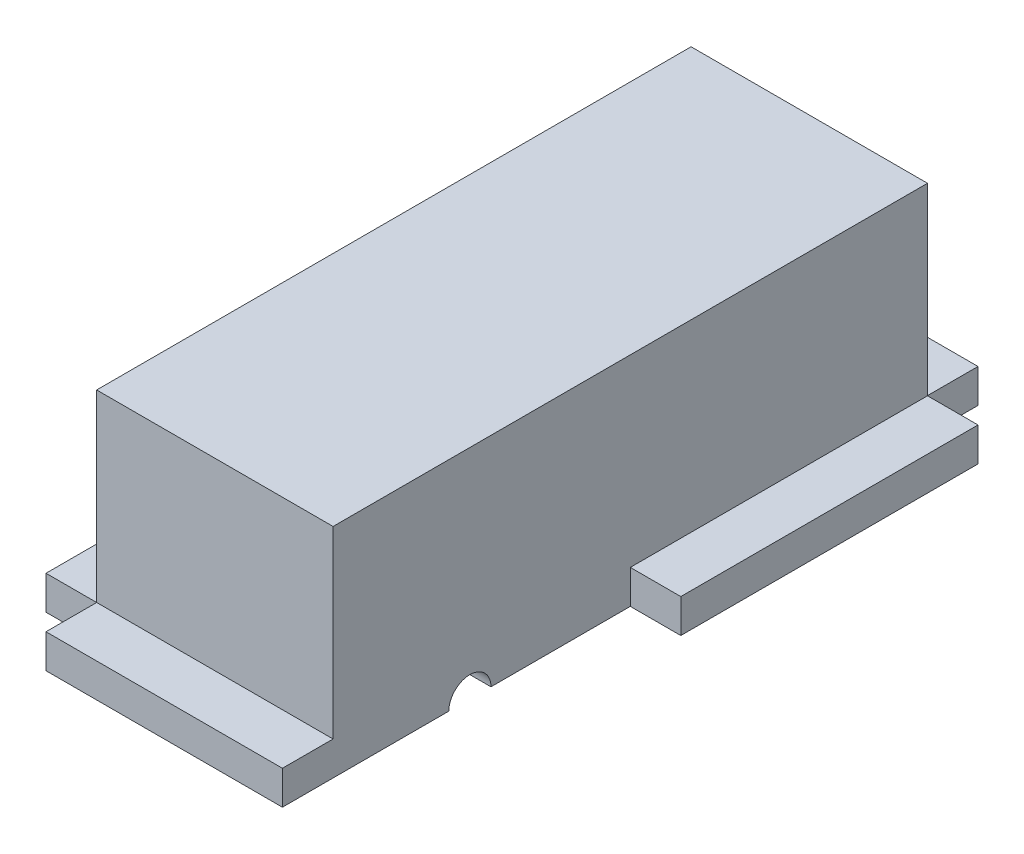
ISO-10303-21;
HEADER;
FILE_DESCRIPTION(('STEP AP214'),'2;1');
FILE_NAME('part.step','',(''),(''),'','','');
FILE_SCHEMA(('AUTOMOTIVE_DESIGN { 1 0 10303 214 1 1 1 1 }'));
ENDSEC;
DATA;
#1=APPLICATION_CONTEXT('core data for automotive mechanical design processes');
#2=APPLICATION_PROTOCOL_DEFINITION('international standard','automotive_design',2000,#1);
#3=PRODUCT_CONTEXT('',#1,'mechanical');
#4=PRODUCT('Part','Part','',(#3));
#5=PRODUCT_RELATED_PRODUCT_CATEGORY('part','',(#4));
#6=PRODUCT_DEFINITION_FORMATION('','',#4);
#7=PRODUCT_DEFINITION_CONTEXT('part definition',#1,'design');
#8=PRODUCT_DEFINITION('design','',#6,#7);
#9=PRODUCT_DEFINITION_SHAPE('','',#8);
#10=(LENGTH_UNIT() NAMED_UNIT(*) SI_UNIT(.MILLI.,.METRE.));
#11=(NAMED_UNIT(*) PLANE_ANGLE_UNIT() SI_UNIT($,.RADIAN.));
#12=(NAMED_UNIT(*) SI_UNIT($,.STERADIAN.) SOLID_ANGLE_UNIT());
#13=UNCERTAINTY_MEASURE_WITH_UNIT(LENGTH_MEASURE(1.E-05),#10,'distance_accuracy_value','');
#14=(GEOMETRIC_REPRESENTATION_CONTEXT(3) GLOBAL_UNCERTAINTY_ASSIGNED_CONTEXT((#13)) GLOBAL_UNIT_ASSIGNED_CONTEXT((#10,
#11,#12)) REPRESENTATION_CONTEXT('',''));
#15=CARTESIAN_POINT('',(0.,0.,0.));
#16=DIRECTION('',(0.,0.,1.));
#17=DIRECTION('',(1.,0.,0.));
#18=AXIS2_PLACEMENT_3D('',#15,#16,#17);
#19=CARTESIAN_POINT('',(-8.89,16.383,22.352));
#20=DIRECTION('',(0.,0.,-1.));
#21=DIRECTION('',(-1.,0.,0.));
#22=AXIS2_PLACEMENT_3D('',#19,#20,#21);
#23=PLANE('',#22);
#24=DIRECTION('',(0.,1.,0.));
#25=VECTOR('',#24,1.);
#26=CARTESIAN_POINT('',(8.89,16.383,22.352));
#27=LINE('',#26,#25);
#28=CARTESIAN_POINT('',(8.89,18.923,22.352));
#29=VERTEX_POINT('',#28);
#30=CARTESIAN_POINT('',(8.89,32.766,22.352));
#31=VERTEX_POINT('',#30);
#32=EDGE_CURVE('E241',#29,#31,#27,.T.);
#33=ORIENTED_EDGE('',*,*,#32,.T.);
#34=DIRECTION('',(1.,0.,0.));
#35=VECTOR('',#34,1.);
#36=CARTESIAN_POINT('',(-8.89,32.766,22.352));
#37=LINE('',#36,#35);
#38=CARTESIAN_POINT('',(-8.89,32.766,22.352));
#39=VERTEX_POINT('',#38);
#40=EDGE_CURVE('E233',#39,#31,#37,.T.);
#41=ORIENTED_EDGE('',*,*,#40,.F.);
#42=DIRECTION('',(0.,1.,0.));
#43=VECTOR('',#42,1.);
#44=CARTESIAN_POINT('',(-8.89,16.383,22.352));
#45=LINE('',#44,#43);
#46=CARTESIAN_POINT('',(-8.89,18.923,22.352));
#47=VERTEX_POINT('',#46);
#48=EDGE_CURVE('E258',#47,#39,#45,.T.);
#49=ORIENTED_EDGE('',*,*,#48,.F.);
#50=DIRECTION('',(-1.,0.,0.));
#51=VECTOR('',#50,1.);
#52=CARTESIAN_POINT('',(8.89,18.923,22.352));
#53=LINE('',#52,#51);
#54=EDGE_CURVE('E388',#29,#47,#53,.T.);
#55=ORIENTED_EDGE('',*,*,#54,.F.);
#56=EDGE_LOOP('',(#33,#41,#49,#55));
#57=FACE_BOUND('',#56,.T.);
#58=ADVANCED_FACE('F41',(#57),#23,.F.);
#59=CARTESIAN_POINT('',(0.,16.383,0.));
#60=DIRECTION('',(0.,-1.,0.));
#61=DIRECTION('',(0.,0.,1.));
#62=AXIS2_PLACEMENT_3D('',#59,#60,#61);
#63=PLANE('',#62);
#64=DIRECTION('',(1.,0.,0.));
#65=VECTOR('',#64,1.);
#66=CARTESIAN_POINT('',(4.572,16.383,13.6525));
#67=LINE('',#66,#65);
#68=CARTESIAN_POINT('',(6.35,16.383,13.6525));
#69=VERTEX_POINT('',#68);
#70=CARTESIAN_POINT('',(8.89,16.383,13.6525));
#71=VERTEX_POINT('',#70);
#72=EDGE_CURVE('E226',#69,#71,#67,.T.);
#73=ORIENTED_EDGE('',*,*,#72,.T.);
#74=DIRECTION('',(0.,0.,-1.));
#75=VECTOR('',#74,1.);
#76=CARTESIAN_POINT('',(8.89,16.383,-22.352));
#77=LINE('',#76,#75);
#78=CARTESIAN_POINT('',(8.89,16.383,26.162));
#79=VERTEX_POINT('',#78);
#80=EDGE_CURVE('E209',#79,#71,#77,.T.);
#81=ORIENTED_EDGE('',*,*,#80,.F.);
#82=DIRECTION('',(-1.,0.,0.));
#83=VECTOR('',#82,1.);
#84=CARTESIAN_POINT('',(8.89,16.383,26.162));
#85=LINE('',#84,#83);
#86=CARTESIAN_POINT('',(-8.89,16.383,26.162));
#87=VERTEX_POINT('',#86);
#88=EDGE_CURVE('E215',#79,#87,#85,.T.);
#89=ORIENTED_EDGE('',*,*,#88,.T.);
#90=DIRECTION('',(0.,0.,1.));
#91=VECTOR('',#90,1.);
#92=CARTESIAN_POINT('',(-8.89,16.383,22.352));
#93=LINE('',#92,#91);
#94=CARTESIAN_POINT('',(-8.89,16.383,22.352));
#95=VERTEX_POINT('',#94);
#96=EDGE_CURVE('E406',#95,#87,#93,.T.);
#97=ORIENTED_EDGE('',*,*,#96,.F.);
#98=DIRECTION('',(1.,0.,0.));
#99=VECTOR('',#98,1.);
#100=CARTESIAN_POINT('',(-8.89,16.383,22.352));
#101=LINE('',#100,#99);
#102=CARTESIAN_POINT('',(-12.7,16.383,22.352));
#103=VERTEX_POINT('',#102);
#104=EDGE_CURVE('E244',#103,#95,#101,.T.);
#105=ORIENTED_EDGE('',*,*,#104,.F.);
#106=DIRECTION('',(0.,0.,-1.));
#107=VECTOR('',#106,1.);
#108=CARTESIAN_POINT('',(-12.7,16.383,22.352));
#109=LINE('',#108,#107);
#110=CARTESIAN_POINT('',(-12.7,16.383,0.));
#111=VERTEX_POINT('',#110);
#112=EDGE_CURVE('E410',#103,#111,#109,.T.);
#113=ORIENTED_EDGE('',*,*,#112,.T.);
#114=DIRECTION('',(-1.,0.,0.));
#115=VECTOR('',#114,1.);
#116=CARTESIAN_POINT('',(-8.89,16.383,0.));
#117=LINE('',#116,#115);
#118=CARTESIAN_POINT('',(-8.89,16.383,0.));
#119=VERTEX_POINT('',#118);
#120=EDGE_CURVE('E409',#119,#111,#117,.T.);
#121=ORIENTED_EDGE('',*,*,#120,.F.);
#122=DIRECTION('',(0.,0.,1.));
#123=VECTOR('',#122,1.);
#124=CARTESIAN_POINT('',(-8.89,16.383,-22.352));
#125=LINE('',#124,#123);
#126=CARTESIAN_POINT('',(-8.89,16.383,-2.15900000000001));
#127=VERTEX_POINT('',#126);
#128=EDGE_CURVE('E231',#127,#119,#125,.T.);
#129=ORIENTED_EDGE('',*,*,#128,.F.);
#130=DIRECTION('',(-1.,0.,0.));
#131=VECTOR('',#130,1.);
#132=CARTESIAN_POINT('',(-4.572,16.383,-2.15900000000001));
#133=LINE('',#132,#131);
#134=CARTESIAN_POINT('',(-6.35,16.383,-2.15900000000001));
#135=VERTEX_POINT('',#134);
#136=EDGE_CURVE('E279',#127,#135,#133,.F.);
#137=ORIENTED_EDGE('',*,*,#136,.T.);
#138=DIRECTION('',(0.,0.,1.));
#139=VECTOR('',#138,1.);
#140=CARTESIAN_POINT('',(-6.35,16.383,-19.812));
#141=LINE('',#140,#139);
#142=CARTESIAN_POINT('',(-6.35,16.383,19.812));
#143=VERTEX_POINT('',#142);
#144=EDGE_CURVE('E305',#135,#143,#141,.T.);
#145=ORIENTED_EDGE('',*,*,#144,.T.);
#146=DIRECTION('',(1.,0.,0.));
#147=VECTOR('',#146,1.);
#148=CARTESIAN_POINT('',(-6.35,16.383,19.812));
#149=LINE('',#148,#147);
#150=CARTESIAN_POINT('',(6.35,16.383,19.812));
#151=VERTEX_POINT('',#150);
#152=EDGE_CURVE('E306',#143,#151,#149,.T.);
#153=ORIENTED_EDGE('',*,*,#152,.T.);
#154=DIRECTION('',(0.,0.,-1.));
#155=VECTOR('',#154,1.);
#156=CARTESIAN_POINT('',(6.35,16.383,-19.812));
#157=LINE('',#156,#155);
#158=EDGE_CURVE('E296',#151,#69,#157,.T.);
#159=ORIENTED_EDGE('',*,*,#158,.T.);
#160=EDGE_LOOP('',(#73,#81,#89,#97,#105,#113,#121,#129,#137,#145,#153,#159));
#161=FACE_BOUND('',#160,.T.);
#162=ADVANCED_FACE('F223',(#161),#63,.T.);
#163=CARTESIAN_POINT('',(8.89,16.383,-22.352));
#164=DIRECTION('',(-1.,0.,0.));
#165=DIRECTION('',(0.,0.,1.));
#166=AXIS2_PLACEMENT_3D('',#163,#164,#165);
#167=PLANE('',#166);
#168=DIRECTION('',(0.,0.,1.));
#169=VECTOR('',#168,1.);
#170=CARTESIAN_POINT('',(8.89,18.923,-22.352));
#171=LINE('',#170,#169);
#172=CARTESIAN_POINT('',(8.89,18.923,-22.352));
#173=VERTEX_POINT('',#172);
#174=CARTESIAN_POINT('',(8.89,18.923,0.));
#175=VERTEX_POINT('',#174);
#176=EDGE_CURVE('E47',#173,#175,#171,.T.);
#177=ORIENTED_EDGE('',*,*,#176,.F.);
#178=DIRECTION('',(0.,1.,0.));
#179=VECTOR('',#178,1.);
#180=CARTESIAN_POINT('',(8.89,16.383,-22.352));
#181=LINE('',#180,#179);
#182=CARTESIAN_POINT('',(8.89,32.766,-22.352));
#183=VERTEX_POINT('',#182);
#184=EDGE_CURVE('E265',#173,#183,#181,.T.);
#185=ORIENTED_EDGE('',*,*,#184,.T.);
#186=DIRECTION('',(0.,0.,-1.));
#187=VECTOR('',#186,1.);
#188=CARTESIAN_POINT('',(8.89,32.766,-22.352));
#189=LINE('',#188,#187);
#190=EDGE_CURVE('E243',#31,#183,#189,.T.);
#191=ORIENTED_EDGE('',*,*,#190,.F.);
#192=ORIENTED_EDGE('',*,*,#32,.F.);
#193=DIRECTION('',(0.,0.,1.));
#194=VECTOR('',#193,1.);
#195=CARTESIAN_POINT('',(8.89,18.923,22.352));
#196=LINE('',#195,#194);
#197=CARTESIAN_POINT('',(8.89,18.923,26.162));
#198=VERTEX_POINT('',#197);
#199=EDGE_CURVE('E208',#29,#198,#196,.T.);
#200=ORIENTED_EDGE('',*,*,#199,.T.);
#201=DIRECTION('',(0.,-1.,0.));
#202=VECTOR('',#201,1.);
#203=CARTESIAN_POINT('',(8.89,18.923,26.162));
#204=LINE('',#203,#202);
#205=EDGE_CURVE('E205',#198,#79,#204,.T.);
#206=ORIENTED_EDGE('',*,*,#205,.T.);
#207=ORIENTED_EDGE('',*,*,#80,.T.);
#208=CARTESIAN_POINT('',(8.89,16.383,12.065));
#209=DIRECTION('',(-1.,0.,0.));
#210=DIRECTION('',(0.,0.,-1.));
#211=AXIS2_PLACEMENT_3D('',#208,#209,#210);
#212=CIRCLE('',#211,1.5875);
#213=CARTESIAN_POINT('',(8.89,16.383,10.4775));
#214=VERTEX_POINT('',#213);
#215=EDGE_CURVE('E266',#71,#214,#212,.T.);
#216=ORIENTED_EDGE('',*,*,#215,.T.);
#217=CARTESIAN_POINT('',(8.89,16.383,0.));
#218=VERTEX_POINT('',#217);
#219=EDGE_CURVE('E228',#214,#218,#77,.T.);
#220=ORIENTED_EDGE('',*,*,#219,.T.);
#221=DIRECTION('',(0.,-1.,0.));
#222=VECTOR('',#221,1.);
#223=CARTESIAN_POINT('',(8.89,16.383,0.));
#224=LINE('',#223,#222);
#225=EDGE_CURVE('E11',#175,#218,#224,.T.);
#226=ORIENTED_EDGE('',*,*,#225,.F.);
#227=EDGE_LOOP('',(#177,#185,#191,#192,#200,#206,#207,#216,#220,#226));
#228=FACE_BOUND('',#227,.T.);
#229=ADVANCED_FACE('F43',(#228),#167,.F.);
#230=CARTESIAN_POINT('',(-8.89,16.383,-22.352));
#231=DIRECTION('',(1.,0.,0.));
#232=DIRECTION('',(0.,0.,-1.));
#233=AXIS2_PLACEMENT_3D('',#230,#231,#232);
#234=PLANE('',#233);
#235=ORIENTED_EDGE('',*,*,#48,.T.);
#236=DIRECTION('',(0.,0.,1.));
#237=VECTOR('',#236,1.);
#238=CARTESIAN_POINT('',(-8.89,32.766,-22.352));
#239=LINE('',#238,#237);
#240=CARTESIAN_POINT('',(-8.89,32.766,-22.352));
#241=VERTEX_POINT('',#240);
#242=EDGE_CURVE('E248',#241,#39,#239,.T.);
#243=ORIENTED_EDGE('',*,*,#242,.F.);
#244=DIRECTION('',(0.,1.,0.));
#245=VECTOR('',#244,1.);
#246=CARTESIAN_POINT('',(-8.89,16.383,-22.352));
#247=LINE('',#246,#245);
#248=CARTESIAN_POINT('',(-8.89,18.923,-22.352));
#249=VERTEX_POINT('',#248);
#250=EDGE_CURVE('E260',#249,#241,#247,.T.);
#251=ORIENTED_EDGE('',*,*,#250,.F.);
#252=DIRECTION('',(0.,0.,-1.));
#253=VECTOR('',#252,1.);
#254=CARTESIAN_POINT('',(-8.89,18.923,-22.352));
#255=LINE('',#254,#253);
#256=CARTESIAN_POINT('',(-8.89,18.923,-26.162));
#257=VERTEX_POINT('',#256);
#258=EDGE_CURVE('E429',#249,#257,#255,.T.);
#259=ORIENTED_EDGE('',*,*,#258,.T.);
#260=DIRECTION('',(0.,-1.,0.));
#261=VECTOR('',#260,1.);
#262=CARTESIAN_POINT('',(-8.89,18.923,-26.162));
#263=LINE('',#262,#261);
#264=CARTESIAN_POINT('',(-8.89,16.383,-26.162));
#265=VERTEX_POINT('',#264);
#266=EDGE_CURVE('E434',#257,#265,#263,.T.);
#267=ORIENTED_EDGE('',*,*,#266,.T.);
#268=CARTESIAN_POINT('',(-8.89,16.383,-8.50900000000001));
#269=VERTEX_POINT('',#268);
#270=EDGE_CURVE('E236',#265,#269,#125,.T.);
#271=ORIENTED_EDGE('',*,*,#270,.T.);
#272=CARTESIAN_POINT('',(-8.89,16.383,-5.33400000000001));
#273=DIRECTION('',(1.,0.,0.));
#274=DIRECTION('',(0.,0.,1.));
#275=AXIS2_PLACEMENT_3D('',#272,#273,#274);
#276=CIRCLE('',#275,3.175);
#277=EDGE_CURVE('E264',#269,#127,#276,.T.);
#278=ORIENTED_EDGE('',*,*,#277,.T.);
#279=ORIENTED_EDGE('',*,*,#128,.T.);
#280=DIRECTION('',(0.,-1.,0.));
#281=VECTOR('',#280,1.);
#282=CARTESIAN_POINT('',(-8.89,18.923,0.));
#283=LINE('',#282,#281);
#284=CARTESIAN_POINT('',(-8.89,18.923,0.));
#285=VERTEX_POINT('',#284);
#286=EDGE_CURVE('E61',#285,#119,#283,.T.);
#287=ORIENTED_EDGE('',*,*,#286,.F.);
#288=DIRECTION('',(0.,0.,-1.));
#289=VECTOR('',#288,1.);
#290=CARTESIAN_POINT('',(-8.89,18.923,22.352));
#291=LINE('',#290,#289);
#292=EDGE_CURVE('E405',#47,#285,#291,.T.);
#293=ORIENTED_EDGE('',*,*,#292,.F.);
#294=EDGE_LOOP('',(#235,#243,#251,#259,#267,#271,#278,#279,#287,#293));
#295=FACE_BOUND('',#294,.T.);
#296=ADVANCED_FACE('F441',(#295),#234,.F.);
#297=CARTESIAN_POINT('',(6.35,16.383,-19.812));
#298=DIRECTION('',(-1.,0.,0.));
#299=DIRECTION('',(0.,0.,1.));
#300=AXIS2_PLACEMENT_3D('',#297,#298,#299);
#301=PLANE('',#300);
#302=CARTESIAN_POINT('',(6.35,16.383,12.065));
#303=DIRECTION('',(1.,0.,0.));
#304=DIRECTION('',(0.,0.,1.));
#305=AXIS2_PLACEMENT_3D('',#302,#303,#304);
#306=CIRCLE('',#305,1.5875);
#307=CARTESIAN_POINT('',(6.35,16.383,10.4775));
#308=VERTEX_POINT('',#307);
#309=EDGE_CURVE('E280',#308,#69,#306,.T.);
#310=ORIENTED_EDGE('',*,*,#309,.T.);
#311=ORIENTED_EDGE('',*,*,#158,.F.);
#312=DIRECTION('',(0.,1.,0.));
#313=VECTOR('',#312,1.);
#314=CARTESIAN_POINT('',(6.35,16.383,19.812));
#315=LINE('',#314,#313);
#316=CARTESIAN_POINT('',(6.35,31.496,19.812));
#317=VERTEX_POINT('',#316);
#318=EDGE_CURVE('E311',#151,#317,#315,.T.);
#319=ORIENTED_EDGE('',*,*,#318,.T.);
#320=DIRECTION('',(0.,0.,1.));
#321=VECTOR('',#320,1.);
#322=CARTESIAN_POINT('',(6.35,31.496,-19.812));
#323=LINE('',#322,#321);
#324=CARTESIAN_POINT('',(6.35,31.496,-19.812));
#325=VERTEX_POINT('',#324);
#326=EDGE_CURVE('E286',#325,#317,#323,.T.);
#327=ORIENTED_EDGE('',*,*,#326,.F.);
#328=DIRECTION('',(0.,1.,0.));
#329=VECTOR('',#328,1.);
#330=CARTESIAN_POINT('',(6.35,16.383,-19.812));
#331=LINE('',#330,#329);
#332=CARTESIAN_POINT('',(6.35,16.383,-19.812));
#333=VERTEX_POINT('',#332);
#334=EDGE_CURVE('E237',#333,#325,#331,.T.);
#335=ORIENTED_EDGE('',*,*,#334,.F.);
#336=EDGE_CURVE('E300',#308,#333,#157,.T.);
#337=ORIENTED_EDGE('',*,*,#336,.F.);
#338=EDGE_LOOP('',(#310,#311,#319,#327,#335,#337));
#339=FACE_BOUND('',#338,.T.);
#340=ADVANCED_FACE('F328',(#339),#301,.T.);
#341=CARTESIAN_POINT('',(-6.35,16.383,-19.812));
#342=DIRECTION('',(0.,0.,1.));
#343=DIRECTION('',(1.,0.,0.));
#344=AXIS2_PLACEMENT_3D('',#341,#342,#343);
#345=PLANE('',#344);
#346=DIRECTION('',(0.,1.,0.));
#347=VECTOR('',#346,1.);
#348=CARTESIAN_POINT('',(-6.35,16.383,-19.812));
#349=LINE('',#348,#347);
#350=CARTESIAN_POINT('',(-6.35,16.383,-19.812));
#351=VERTEX_POINT('',#350);
#352=CARTESIAN_POINT('',(-6.35,31.496,-19.812));
#353=VERTEX_POINT('',#352);
#354=EDGE_CURVE('E316',#351,#353,#349,.T.);
#355=ORIENTED_EDGE('',*,*,#354,.F.);
#356=DIRECTION('',(-1.,0.,0.));
#357=VECTOR('',#356,1.);
#358=CARTESIAN_POINT('',(-6.35,16.383,-19.812));
#359=LINE('',#358,#357);
#360=EDGE_CURVE('E303',#333,#351,#359,.T.);
#361=ORIENTED_EDGE('',*,*,#360,.F.);
#362=ORIENTED_EDGE('',*,*,#334,.T.);
#363=DIRECTION('',(1.,0.,0.));
#364=VECTOR('',#363,1.);
#365=CARTESIAN_POINT('',(-6.35,31.496,-19.812));
#366=LINE('',#365,#364);
#367=EDGE_CURVE('E297',#353,#325,#366,.T.);
#368=ORIENTED_EDGE('',*,*,#367,.F.);
#369=EDGE_LOOP('',(#355,#361,#362,#368));
#370=FACE_BOUND('',#369,.T.);
#371=ADVANCED_FACE('F327',(#370),#345,.T.);
#372=CARTESIAN_POINT('',(-6.35,16.383,-19.812));
#373=DIRECTION('',(1.,0.,0.));
#374=DIRECTION('',(0.,0.,-1.));
#375=AXIS2_PLACEMENT_3D('',#372,#373,#374);
#376=PLANE('',#375);
#377=CARTESIAN_POINT('',(-6.35,16.383,-5.33400000000001));
#378=DIRECTION('',(-1.,0.,0.));
#379=DIRECTION('',(0.,0.,-1.));
#380=AXIS2_PLACEMENT_3D('',#377,#378,#379);
#381=CIRCLE('',#380,3.175);
#382=CARTESIAN_POINT('',(-6.35,16.383,-8.50900000000001));
#383=VERTEX_POINT('',#382);
#384=EDGE_CURVE('E281',#135,#383,#381,.T.);
#385=ORIENTED_EDGE('',*,*,#384,.T.);
#386=EDGE_CURVE('E304',#351,#383,#141,.T.);
#387=ORIENTED_EDGE('',*,*,#386,.F.);
#388=ORIENTED_EDGE('',*,*,#354,.T.);
#389=DIRECTION('',(0.,0.,-1.));
#390=VECTOR('',#389,1.);
#391=CARTESIAN_POINT('',(-6.35,31.496,-19.812));
#392=LINE('',#391,#390);
#393=CARTESIAN_POINT('',(-6.35,31.496,19.812));
#394=VERTEX_POINT('',#393);
#395=EDGE_CURVE('E294',#394,#353,#392,.T.);
#396=ORIENTED_EDGE('',*,*,#395,.F.);
#397=DIRECTION('',(0.,1.,0.));
#398=VECTOR('',#397,1.);
#399=CARTESIAN_POINT('',(-6.35,16.383,19.812));
#400=LINE('',#399,#398);
#401=EDGE_CURVE('E312',#143,#394,#400,.T.);
#402=ORIENTED_EDGE('',*,*,#401,.F.);
#403=ORIENTED_EDGE('',*,*,#144,.F.);
#404=EDGE_LOOP('',(#385,#387,#388,#396,#402,#403));
#405=FACE_BOUND('',#404,.T.);
#406=ADVANCED_FACE('F331',(#405),#376,.T.);
#407=CARTESIAN_POINT('',(-6.35,16.383,19.812));
#408=DIRECTION('',(0.,0.,-1.));
#409=DIRECTION('',(-1.,0.,0.));
#410=AXIS2_PLACEMENT_3D('',#407,#408,#409);
#411=PLANE('',#410);
#412=ORIENTED_EDGE('',*,*,#318,.F.);
#413=ORIENTED_EDGE('',*,*,#152,.F.);
#414=ORIENTED_EDGE('',*,*,#401,.T.);
#415=DIRECTION('',(-1.,0.,0.));
#416=VECTOR('',#415,1.);
#417=CARTESIAN_POINT('',(-6.35,31.496,19.812));
#418=LINE('',#417,#416);
#419=EDGE_CURVE('E295',#317,#394,#418,.T.);
#420=ORIENTED_EDGE('',*,*,#419,.F.);
#421=EDGE_LOOP('',(#412,#413,#414,#420));
#422=FACE_BOUND('',#421,.T.);
#423=ADVANCED_FACE('F339',(#422),#411,.T.);
#424=ORIENTED_EDGE('',*,*,#219,.F.);
#425=DIRECTION('',(1.,0.,0.));
#426=VECTOR('',#425,1.);
#427=CARTESIAN_POINT('',(4.572,16.383,10.4775));
#428=LINE('',#427,#426);
#429=EDGE_CURVE('E274',#214,#308,#428,.F.);
#430=ORIENTED_EDGE('',*,*,#429,.T.);
#431=ORIENTED_EDGE('',*,*,#336,.T.);
#432=ORIENTED_EDGE('',*,*,#360,.T.);
#433=ORIENTED_EDGE('',*,*,#386,.T.);
#434=DIRECTION('',(-1.,0.,0.));
#435=VECTOR('',#434,1.);
#436=CARTESIAN_POINT('',(-4.572,16.383,-8.50900000000001));
#437=LINE('',#436,#435);
#438=EDGE_CURVE('E289',#383,#269,#437,.T.);
#439=ORIENTED_EDGE('',*,*,#438,.T.);
#440=ORIENTED_EDGE('',*,*,#270,.F.);
#441=DIRECTION('',(1.,0.,0.));
#442=VECTOR('',#441,1.);
#443=CARTESIAN_POINT('',(-8.89,16.383,-26.162));
#444=LINE('',#443,#442);
#445=CARTESIAN_POINT('',(8.87743678880745,16.383,-26.162));
#446=VERTEX_POINT('',#445);
#447=EDGE_CURVE('E412',#265,#446,#444,.T.);
#448=ORIENTED_EDGE('',*,*,#447,.T.);
#449=DIRECTION('',(0.,0.,-1.));
#450=VECTOR('',#449,1.);
#451=CARTESIAN_POINT('',(8.87743678880745,16.383,-22.352));
#452=LINE('',#451,#450);
#453=CARTESIAN_POINT('',(8.87743678880744,16.383,-22.352));
#454=VERTEX_POINT('',#453);
#455=EDGE_CURVE('E375',#454,#446,#452,.T.);
#456=ORIENTED_EDGE('',*,*,#455,.F.);
#457=DIRECTION('',(-1.,0.,0.));
#458=VECTOR('',#457,1.);
#459=CARTESIAN_POINT('',(-8.89,16.383,-22.352));
#460=LINE('',#459,#458);
#461=CARTESIAN_POINT('',(12.6874367888074,16.383,-22.352));
#462=VERTEX_POINT('',#461);
#463=EDGE_CURVE('E230',#462,#454,#460,.T.);
#464=ORIENTED_EDGE('',*,*,#463,.F.);
#465=DIRECTION('',(0.,0.,1.));
#466=VECTOR('',#465,1.);
#467=CARTESIAN_POINT('',(12.6874367888074,16.383,-22.352));
#468=LINE('',#467,#466);
#469=CARTESIAN_POINT('',(12.6874367888074,16.383,0.));
#470=VERTEX_POINT('',#469);
#471=EDGE_CURVE('E361',#462,#470,#468,.T.);
#472=ORIENTED_EDGE('',*,*,#471,.T.);
#473=DIRECTION('',(1.,0.,0.));
#474=VECTOR('',#473,1.);
#475=CARTESIAN_POINT('',(8.87743678880745,16.383,0.));
#476=LINE('',#475,#474);
#477=EDGE_CURVE('E354',#218,#470,#476,.T.);
#478=ORIENTED_EDGE('',*,*,#477,.F.);
#479=EDGE_LOOP('',(#424,#430,#431,#432,#433,#439,#440,#448,#456,#464,#472,#478));
#480=FACE_BOUND('',#479,.T.);
#481=ADVANCED_FACE('F346',(#480),#63,.T.);
#482=CARTESIAN_POINT('',(0.,32.766,0.));
#483=DIRECTION('',(0.,-1.,0.));
#484=DIRECTION('',(0.,0.,1.));
#485=AXIS2_PLACEMENT_3D('',#482,#483,#484);
#486=PLANE('',#485);
#487=ORIENTED_EDGE('',*,*,#190,.T.);
#488=DIRECTION('',(-1.,0.,0.));
#489=VECTOR('',#488,1.);
#490=CARTESIAN_POINT('',(-8.89,32.766,-22.352));
#491=LINE('',#490,#489);
#492=EDGE_CURVE('E246',#183,#241,#491,.T.);
#493=ORIENTED_EDGE('',*,*,#492,.T.);
#494=ORIENTED_EDGE('',*,*,#242,.T.);
#495=ORIENTED_EDGE('',*,*,#40,.T.);
#496=EDGE_LOOP('',(#487,#493,#494,#495));
#497=FACE_BOUND('',#496,.T.);
#498=ADVANCED_FACE('F384',(#497),#486,.F.);
#499=CARTESIAN_POINT('',(-8.89,16.383,-22.352));
#500=DIRECTION('',(0.,0.,1.));
#501=DIRECTION('',(1.,0.,0.));
#502=AXIS2_PLACEMENT_3D('',#499,#500,#501);
#503=PLANE('',#502);
#504=ORIENTED_EDGE('',*,*,#250,.T.);
#505=ORIENTED_EDGE('',*,*,#492,.F.);
#506=ORIENTED_EDGE('',*,*,#184,.F.);
#507=DIRECTION('',(1.,0.,0.));
#508=VECTOR('',#507,1.);
#509=CARTESIAN_POINT('',(8.87743678880745,18.923,-22.352));
#510=LINE('',#509,#508);
#511=CARTESIAN_POINT('',(12.6874367888074,18.923,-22.352));
#512=VERTEX_POINT('',#511);
#513=EDGE_CURVE('E363',#173,#512,#510,.T.);
#514=ORIENTED_EDGE('',*,*,#513,.T.);
#515=DIRECTION('',(0.,-1.,0.));
#516=VECTOR('',#515,1.);
#517=CARTESIAN_POINT('',(12.6874367888074,18.923,-22.352));
#518=LINE('',#517,#516);
#519=EDGE_CURVE('E277',#512,#462,#518,.T.);
#520=ORIENTED_EDGE('',*,*,#519,.T.);
#521=ORIENTED_EDGE('',*,*,#463,.T.);
#522=DIRECTION('',(0.,-1.,0.));
#523=VECTOR('',#522,1.);
#524=CARTESIAN_POINT('',(8.87743678880745,18.923,-22.352));
#525=LINE('',#524,#523);
#526=CARTESIAN_POINT('',(8.87743678880745,18.923,-22.352));
#527=VERTEX_POINT('',#526);
#528=EDGE_CURVE('E425',#527,#454,#525,.T.);
#529=ORIENTED_EDGE('',*,*,#528,.F.);
#530=DIRECTION('',(1.,0.,0.));
#531=VECTOR('',#530,1.);
#532=CARTESIAN_POINT('',(-8.89,18.923,-22.352));
#533=LINE('',#532,#531);
#534=EDGE_CURVE('E427',#249,#527,#533,.T.);
#535=ORIENTED_EDGE('',*,*,#534,.F.);
#536=EDGE_LOOP('',(#504,#505,#506,#514,#520,#521,#529,#535));
#537=FACE_BOUND('',#536,.T.);
#538=ADVANCED_FACE('F382',(#537),#503,.F.);
#539=DIRECTION('',(-1.,0.,0.));
#540=VECTOR('',#539,1.);
#541=CARTESIAN_POINT('',(-8.89,18.923,22.352));
#542=LINE('',#541,#540);
#543=CARTESIAN_POINT('',(-12.7,18.923,22.352));
#544=VERTEX_POINT('',#543);
#545=EDGE_CURVE('E417',#47,#544,#542,.T.);
#546=ORIENTED_EDGE('',*,*,#545,.T.);
#547=DIRECTION('',(0.,-1.,0.));
#548=VECTOR('',#547,1.);
#549=CARTESIAN_POINT('',(-12.7,18.923,22.352));
#550=LINE('',#549,#548);
#551=EDGE_CURVE('E403',#544,#103,#550,.T.);
#552=ORIENTED_EDGE('',*,*,#551,.T.);
#553=ORIENTED_EDGE('',*,*,#104,.T.);
#554=DIRECTION('',(0.,-1.,0.));
#555=VECTOR('',#554,1.);
#556=CARTESIAN_POINT('',(-8.89,18.923,22.352));
#557=LINE('',#556,#555);
#558=EDGE_CURVE('E57',#47,#95,#557,.T.);
#559=ORIENTED_EDGE('',*,*,#558,.F.);
#560=EDGE_LOOP('',(#546,#552,#553,#559));
#561=FACE_BOUND('',#560,.T.);
#562=ADVANCED_FACE('F464',(#561),#23,.F.);
#563=CARTESIAN_POINT('',(0.,31.496,0.));
#564=DIRECTION('',(0.,-1.,0.));
#565=DIRECTION('',(0.,0.,1.));
#566=AXIS2_PLACEMENT_3D('',#563,#564,#565);
#567=PLANE('',#566);
#568=ORIENTED_EDGE('',*,*,#326,.T.);
#569=ORIENTED_EDGE('',*,*,#419,.T.);
#570=ORIENTED_EDGE('',*,*,#395,.T.);
#571=ORIENTED_EDGE('',*,*,#367,.T.);
#572=EDGE_LOOP('',(#568,#569,#570,#571));
#573=FACE_BOUND('',#572,.T.);
#574=ADVANCED_FACE('F335',(#573),#567,.T.);
#575=CARTESIAN_POINT('',(-4.572,16.383,-5.33400000000001));
#576=DIRECTION('',(-1.,0.,0.));
#577=DIRECTION('',(0.,0.,1.));
#578=AXIS2_PLACEMENT_3D('',#575,#576,#577);
#579=CYLINDRICAL_SURFACE('',#578,3.175);
#580=ORIENTED_EDGE('',*,*,#438,.F.);
#581=ORIENTED_EDGE('',*,*,#384,.F.);
#582=ORIENTED_EDGE('',*,*,#136,.F.);
#583=ORIENTED_EDGE('',*,*,#277,.F.);
#584=EDGE_LOOP('',(#580,#581,#582,#583));
#585=FACE_BOUND('',#584,.T.);
#586=ADVANCED_FACE('F343',(#585),#579,.F.);
#587=CARTESIAN_POINT('',(4.572,16.383,12.065));
#588=DIRECTION('',(1.,0.,0.));
#589=DIRECTION('',(0.,0.,-1.));
#590=AXIS2_PLACEMENT_3D('',#587,#588,#589);
#591=CYLINDRICAL_SURFACE('',#590,1.5875);
#592=ORIENTED_EDGE('',*,*,#72,.F.);
#593=ORIENTED_EDGE('',*,*,#309,.F.);
#594=ORIENTED_EDGE('',*,*,#429,.F.);
#595=ORIENTED_EDGE('',*,*,#215,.F.);
#596=EDGE_LOOP('',(#592,#593,#594,#595));
#597=FACE_BOUND('',#596,.T.);
#598=ADVANCED_FACE('F353',(#597),#591,.F.);
#599=CARTESIAN_POINT('',(8.87743678880745,18.923,0.));
#600=DIRECTION('',(0.,0.,1.));
#601=DIRECTION('',(1.,0.,0.));
#602=AXIS2_PLACEMENT_3D('',#599,#600,#601);
#603=PLANE('',#602);
#604=ORIENTED_EDGE('',*,*,#225,.T.);
#605=ORIENTED_EDGE('',*,*,#477,.T.);
#606=DIRECTION('',(0.,-1.,0.));
#607=VECTOR('',#606,1.);
#608=CARTESIAN_POINT('',(12.6874367888074,18.923,0.));
#609=LINE('',#608,#607);
#610=CARTESIAN_POINT('',(12.6874367888074,18.923,0.));
#611=VERTEX_POINT('',#610);
#612=EDGE_CURVE('E273',#611,#470,#609,.T.);
#613=ORIENTED_EDGE('',*,*,#612,.F.);
#614=DIRECTION('',(1.,0.,0.));
#615=VECTOR('',#614,1.);
#616=CARTESIAN_POINT('',(8.87743678880745,18.923,0.));
#617=LINE('',#616,#615);
#618=EDGE_CURVE('E357',#175,#611,#617,.T.);
#619=ORIENTED_EDGE('',*,*,#618,.F.);
#620=EDGE_LOOP('',(#604,#605,#613,#619));
#621=FACE_BOUND('',#620,.T.);
#622=ADVANCED_FACE('F360',(#621),#603,.T.);
#623=CARTESIAN_POINT('',(0.,18.923,0.));
#624=DIRECTION('',(0.,1.,0.));
#625=DIRECTION('',(0.,0.,-1.));
#626=AXIS2_PLACEMENT_3D('',#623,#624,#625);
#627=PLANE('',#626);
#628=ORIENTED_EDGE('',*,*,#176,.T.);
#629=ORIENTED_EDGE('',*,*,#618,.T.);
#630=DIRECTION('',(0.,0.,1.));
#631=VECTOR('',#630,1.);
#632=CARTESIAN_POINT('',(12.6874367888074,18.923,-22.352));
#633=LINE('',#632,#631);
#634=EDGE_CURVE('E359',#512,#611,#633,.T.);
#635=ORIENTED_EDGE('',*,*,#634,.F.);
#636=ORIENTED_EDGE('',*,*,#513,.F.);
#637=EDGE_LOOP('',(#628,#629,#635,#636));
#638=FACE_BOUND('',#637,.T.);
#639=ADVANCED_FACE('F376',(#638),#627,.T.);
#640=CARTESIAN_POINT('',(12.6874367888074,18.923,-22.352));
#641=DIRECTION('',(-1.,0.,0.));
#642=DIRECTION('',(0.,0.,1.));
#643=AXIS2_PLACEMENT_3D('',#640,#641,#642);
#644=PLANE('',#643);
#645=ORIENTED_EDGE('',*,*,#471,.F.);
#646=ORIENTED_EDGE('',*,*,#519,.F.);
#647=ORIENTED_EDGE('',*,*,#634,.T.);
#648=ORIENTED_EDGE('',*,*,#612,.T.);
#649=EDGE_LOOP('',(#645,#646,#647,#648));
#650=FACE_BOUND('',#649,.T.);
#651=ADVANCED_FACE('F379',(#650),#644,.F.);
#652=CARTESIAN_POINT('',(-8.89,18.923,-26.162));
#653=DIRECTION('',(0.,0.,1.));
#654=DIRECTION('',(1.,0.,0.));
#655=AXIS2_PLACEMENT_3D('',#652,#653,#654);
#656=PLANE('',#655);
#657=ORIENTED_EDGE('',*,*,#447,.F.);
#658=ORIENTED_EDGE('',*,*,#266,.F.);
#659=DIRECTION('',(1.,0.,0.));
#660=VECTOR('',#659,1.);
#661=CARTESIAN_POINT('',(-8.89,18.923,-26.162));
#662=LINE('',#661,#660);
#663=CARTESIAN_POINT('',(8.87743678880745,18.923,-26.162));
#664=VERTEX_POINT('',#663);
#665=EDGE_CURVE('E423',#257,#664,#662,.T.);
#666=ORIENTED_EDGE('',*,*,#665,.T.);
#667=DIRECTION('',(0.,-1.,0.));
#668=VECTOR('',#667,1.);
#669=CARTESIAN_POINT('',(8.87743678880745,18.923,-26.162));
#670=LINE('',#669,#668);
#671=EDGE_CURVE('E370',#664,#446,#670,.T.);
#672=ORIENTED_EDGE('',*,*,#671,.T.);
#673=EDGE_LOOP('',(#657,#658,#666,#672));
#674=FACE_BOUND('',#673,.T.);
#675=ADVANCED_FACE('F448',(#674),#656,.F.);
#676=CARTESIAN_POINT('',(8.87743678880745,18.923,-22.352));
#677=DIRECTION('',(1.,0.,0.));
#678=DIRECTION('',(0.,0.,-1.));
#679=AXIS2_PLACEMENT_3D('',#676,#677,#678);
#680=PLANE('',#679);
#681=ORIENTED_EDGE('',*,*,#455,.T.);
#682=ORIENTED_EDGE('',*,*,#671,.F.);
#683=DIRECTION('',(0.,0.,-1.));
#684=VECTOR('',#683,1.);
#685=CARTESIAN_POINT('',(8.87743678880745,18.923,-22.352));
#686=LINE('',#685,#684);
#687=EDGE_CURVE('E428',#527,#664,#686,.T.);
#688=ORIENTED_EDGE('',*,*,#687,.F.);
#689=ORIENTED_EDGE('',*,*,#528,.T.);
#690=EDGE_LOOP('',(#681,#682,#688,#689));
#691=FACE_BOUND('',#690,.T.);
#692=ADVANCED_FACE('F455',(#691),#680,.T.);
#693=CARTESIAN_POINT('',(0.,18.923,0.));
#694=DIRECTION('',(0.,-1.,0.));
#695=DIRECTION('',(0.,0.,1.));
#696=AXIS2_PLACEMENT_3D('',#693,#694,#695);
#697=PLANE('',#696);
#698=ORIENTED_EDGE('',*,*,#665,.F.);
#699=ORIENTED_EDGE('',*,*,#258,.F.);
#700=ORIENTED_EDGE('',*,*,#534,.T.);
#701=ORIENTED_EDGE('',*,*,#687,.T.);
#702=EDGE_LOOP('',(#698,#699,#700,#701));
#703=FACE_BOUND('',#702,.T.);
#704=ADVANCED_FACE('F454',(#703),#697,.F.);
#705=CARTESIAN_POINT('',(-8.89,18.923,0.));
#706=DIRECTION('',(0.,0.,-1.));
#707=DIRECTION('',(-1.,0.,0.));
#708=AXIS2_PLACEMENT_3D('',#705,#706,#707);
#709=PLANE('',#708);
#710=ORIENTED_EDGE('',*,*,#120,.T.);
#711=DIRECTION('',(0.,-1.,0.));
#712=VECTOR('',#711,1.);
#713=CARTESIAN_POINT('',(-12.7,18.923,0.));
#714=LINE('',#713,#712);
#715=CARTESIAN_POINT('',(-12.7,18.923,0.));
#716=VERTEX_POINT('',#715);
#717=EDGE_CURVE('E397',#716,#111,#714,.T.);
#718=ORIENTED_EDGE('',*,*,#717,.F.);
#719=DIRECTION('',(-1.,0.,0.));
#720=VECTOR('',#719,1.);
#721=CARTESIAN_POINT('',(-8.89,18.923,0.));
#722=LINE('',#721,#720);
#723=EDGE_CURVE('E411',#285,#716,#722,.T.);
#724=ORIENTED_EDGE('',*,*,#723,.F.);
#725=ORIENTED_EDGE('',*,*,#286,.T.);
#726=EDGE_LOOP('',(#710,#718,#724,#725));
#727=FACE_BOUND('',#726,.T.);
#728=ADVANCED_FACE('F633',(#727),#709,.T.);
#729=CARTESIAN_POINT('',(-12.7,18.923,22.352));
#730=DIRECTION('',(1.,0.,0.));
#731=DIRECTION('',(0.,0.,-1.));
#732=AXIS2_PLACEMENT_3D('',#729,#730,#731);
#733=PLANE('',#732);
#734=ORIENTED_EDGE('',*,*,#112,.F.);
#735=ORIENTED_EDGE('',*,*,#551,.F.);
#736=DIRECTION('',(0.,0.,-1.));
#737=VECTOR('',#736,1.);
#738=CARTESIAN_POINT('',(-12.7,18.923,22.352));
#739=LINE('',#738,#737);
#740=EDGE_CURVE('E416',#544,#716,#739,.T.);
#741=ORIENTED_EDGE('',*,*,#740,.T.);
#742=ORIENTED_EDGE('',*,*,#717,.T.);
#743=EDGE_LOOP('',(#734,#735,#741,#742));
#744=FACE_BOUND('',#743,.T.);
#745=ADVANCED_FACE('F603',(#744),#733,.F.);
#746=CARTESIAN_POINT('',(0.,18.923,0.));
#747=DIRECTION('',(0.,1.,0.));
#748=DIRECTION('',(0.,0.,-1.));
#749=AXIS2_PLACEMENT_3D('',#746,#747,#748);
#750=PLANE('',#749);
#751=ORIENTED_EDGE('',*,*,#723,.T.);
#752=ORIENTED_EDGE('',*,*,#740,.F.);
#753=ORIENTED_EDGE('',*,*,#545,.F.);
#754=ORIENTED_EDGE('',*,*,#292,.T.);
#755=EDGE_LOOP('',(#751,#752,#753,#754));
#756=FACE_BOUND('',#755,.T.);
#757=ADVANCED_FACE('F458',(#756),#750,.T.);
#758=CARTESIAN_POINT('',(8.89,18.923,26.162));
#759=DIRECTION('',(0.,0.,-1.));
#760=DIRECTION('',(-1.,0.,0.));
#761=AXIS2_PLACEMENT_3D('',#758,#759,#760);
#762=PLANE('',#761);
#763=ORIENTED_EDGE('',*,*,#88,.F.);
#764=ORIENTED_EDGE('',*,*,#205,.F.);
#765=DIRECTION('',(-1.,0.,0.));
#766=VECTOR('',#765,1.);
#767=CARTESIAN_POINT('',(8.89,18.923,26.162));
#768=LINE('',#767,#766);
#769=CARTESIAN_POINT('',(-8.89,18.923,26.162));
#770=VERTEX_POINT('',#769);
#771=EDGE_CURVE('E391',#198,#770,#768,.T.);
#772=ORIENTED_EDGE('',*,*,#771,.T.);
#773=DIRECTION('',(0.,-1.,0.));
#774=VECTOR('',#773,1.);
#775=CARTESIAN_POINT('',(-8.89,18.923,26.162));
#776=LINE('',#775,#774);
#777=EDGE_CURVE('E219',#770,#87,#776,.T.);
#778=ORIENTED_EDGE('',*,*,#777,.T.);
#779=EDGE_LOOP('',(#763,#764,#772,#778));
#780=FACE_BOUND('',#779,.T.);
#781=ADVANCED_FACE('F220',(#780),#762,.F.);
#782=CARTESIAN_POINT('',(-8.89,18.923,22.352));
#783=DIRECTION('',(-1.,0.,0.));
#784=DIRECTION('',(0.,0.,1.));
#785=AXIS2_PLACEMENT_3D('',#782,#783,#784);
#786=PLANE('',#785);
#787=ORIENTED_EDGE('',*,*,#96,.T.);
#788=ORIENTED_EDGE('',*,*,#777,.F.);
#789=DIRECTION('',(0.,0.,1.));
#790=VECTOR('',#789,1.);
#791=CARTESIAN_POINT('',(-8.89,18.923,22.352));
#792=LINE('',#791,#790);
#793=EDGE_CURVE('E211',#47,#770,#792,.T.);
#794=ORIENTED_EDGE('',*,*,#793,.F.);
#795=ORIENTED_EDGE('',*,*,#558,.T.);
#796=EDGE_LOOP('',(#787,#788,#794,#795));
#797=FACE_BOUND('',#796,.T.);
#798=ADVANCED_FACE('F469',(#797),#786,.T.);
#799=CARTESIAN_POINT('',(0.,18.923,0.));
#800=DIRECTION('',(0.,-1.,0.));
#801=DIRECTION('',(0.,0.,1.));
#802=AXIS2_PLACEMENT_3D('',#799,#800,#801);
#803=PLANE('',#802);
#804=ORIENTED_EDGE('',*,*,#771,.F.);
#805=ORIENTED_EDGE('',*,*,#199,.F.);
#806=ORIENTED_EDGE('',*,*,#54,.T.);
#807=ORIENTED_EDGE('',*,*,#793,.T.);
#808=EDGE_LOOP('',(#804,#805,#806,#807));
#809=FACE_BOUND('',#808,.T.);
#810=ADVANCED_FACE('F470',(#809),#803,.F.);
#811=CLOSED_SHELL('',(#58,#162,#229,#296,#340,#371,#406,#423,#481,#498,#538,#562,#574,#586,#598,
#622,#639,#651,#675,#692,#704,#728,#745,#757,#781,#798,#810));
#812=MANIFOLD_SOLID_BREP('B2',#811);
#813=ADVANCED_BREP_SHAPE_REPRESENTATION('',(#18,#812),#14);
#814=SHAPE_DEFINITION_REPRESENTATION(#9,#813);
ENDSEC;
END-ISO-10303-21;
